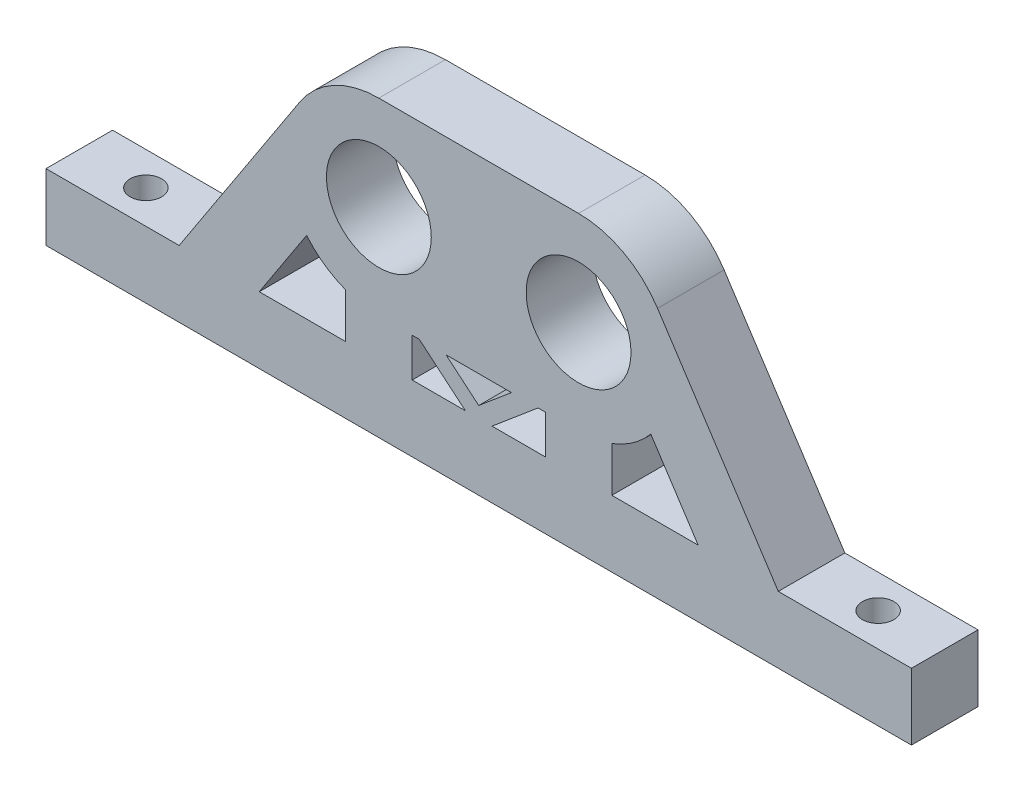
ISO-10303-21;
HEADER;
FILE_DESCRIPTION(('STEP AP214'),'2;1');
FILE_NAME('part.step','',(''),(''),'','','');
FILE_SCHEMA(('AUTOMOTIVE_DESIGN { 1 0 10303 214 1 1 1 1 }'));
ENDSEC;
DATA;
#1=APPLICATION_CONTEXT('core data for automotive mechanical design processes');
#2=APPLICATION_PROTOCOL_DEFINITION('international standard','automotive_design',2000,#1);
#3=PRODUCT_CONTEXT('',#1,'mechanical');
#4=PRODUCT('Part','Part','',(#3));
#5=PRODUCT_RELATED_PRODUCT_CATEGORY('part','',(#4));
#6=PRODUCT_DEFINITION_FORMATION('','',#4);
#7=PRODUCT_DEFINITION_CONTEXT('part definition',#1,'design');
#8=PRODUCT_DEFINITION('design','',#6,#7);
#9=PRODUCT_DEFINITION_SHAPE('','',#8);
#10=(LENGTH_UNIT() NAMED_UNIT(*) SI_UNIT(.MILLI.,.METRE.));
#11=(NAMED_UNIT(*) PLANE_ANGLE_UNIT() SI_UNIT($,.RADIAN.));
#12=(NAMED_UNIT(*) SI_UNIT($,.STERADIAN.) SOLID_ANGLE_UNIT());
#13=UNCERTAINTY_MEASURE_WITH_UNIT(LENGTH_MEASURE(1.E-05),#10,'distance_accuracy_value','');
#14=(GEOMETRIC_REPRESENTATION_CONTEXT(3) GLOBAL_UNCERTAINTY_ASSIGNED_CONTEXT((#13)) GLOBAL_UNIT_ASSIGNED_CONTEXT((#10,
#11,#12)) REPRESENTATION_CONTEXT('',''));
#15=CARTESIAN_POINT('',(0.,0.,0.));
#16=DIRECTION('',(0.,0.,1.));
#17=DIRECTION('',(1.,0.,0.));
#18=AXIS2_PLACEMENT_3D('',#15,#16,#17);
#19=CARTESIAN_POINT('',(-2.17890041270888,1.42380954605319,-6.35));
#20=DIRECTION('',(-0.837120234007988,0.547018933689147,0.));
#21=DIRECTION('',(-0.547018933689147,-0.837120234007988,0.));
#22=AXIS2_PLACEMENT_3D('',#19,#20,#21);
#23=PLANE('',#22);
#24=DIRECTION('',(-0.547018933689148,-0.837120234007988,0.));
#25=VECTOR('',#24,1.);
#26=CARTESIAN_POINT('',(-2.17890041270888,1.42380954605319,0.));
#27=LINE('',#26,#25);
#28=CARTESIAN_POINT('',(-6.89168867397579,-5.78831816860423,0.));
#29=VERTEX_POINT('',#28);
#30=CARTESIAN_POINT('',(-11.4081495977631,-12.7,0.));
#31=VERTEX_POINT('',#30);
#32=EDGE_CURVE('E395',#29,#31,#27,.T.);
#33=ORIENTED_EDGE('',*,*,#32,.T.);
#34=DIRECTION('',(0.,0.,1.));
#35=VECTOR('',#34,1.);
#36=CARTESIAN_POINT('',(-11.4081495977631,-12.7,-6.35));
#37=LINE('',#36,#35);
#38=CARTESIAN_POINT('',(-11.4081495977631,-12.7,-6.35));
#39=VERTEX_POINT('',#38);
#40=EDGE_CURVE('E11',#39,#31,#37,.T.);
#41=ORIENTED_EDGE('',*,*,#40,.F.);
#42=DIRECTION('',(-0.547018933689148,-0.837120234007988,0.));
#43=VECTOR('',#42,1.);
#44=CARTESIAN_POINT('',(-2.17890041270888,1.42380954605319,-6.35));
#45=LINE('',#44,#43);
#46=CARTESIAN_POINT('',(-6.89168867397579,-5.78831816860423,-6.35));
#47=VERTEX_POINT('',#46);
#48=EDGE_CURVE('E251',#47,#39,#45,.T.);
#49=ORIENTED_EDGE('',*,*,#48,.F.);
#50=DIRECTION('',(0.,0.,1.));
#51=VECTOR('',#50,1.);
#52=CARTESIAN_POINT('',(-6.89168867397579,-5.78831816860423,-6.35));
#53=LINE('',#52,#51);
#54=EDGE_CURVE('E242',#47,#29,#53,.T.);
#55=ORIENTED_EDGE('',*,*,#54,.T.);
#56=EDGE_LOOP('',(#33,#41,#49,#55));
#57=FACE_BOUND('',#56,.T.);
#58=ADVANCED_FACE('F35',(#57),#23,.F.);
#59=CARTESIAN_POINT('',(0.,-12.7,-6.35));
#60=DIRECTION('',(0.,-1.,0.));
#61=DIRECTION('',(0.,0.,-1.));
#62=AXIS2_PLACEMENT_3D('',#59,#60,#61);
#63=PLANE('',#62);
#64=DIRECTION('',(1.,0.,0.));
#65=VECTOR('',#64,1.);
#66=CARTESIAN_POINT('',(0.,-12.7,0.));
#67=LINE('',#66,#65);
#68=CARTESIAN_POINT('',(-3.175,-12.7,0.));
#69=VERTEX_POINT('',#68);
#70=EDGE_CURVE('E150',#31,#69,#67,.T.);
#71=ORIENTED_EDGE('',*,*,#70,.T.);
#72=DIRECTION('',(0.,0.,1.));
#73=VECTOR('',#72,1.);
#74=CARTESIAN_POINT('',(-3.175,-12.7,-6.35));
#75=LINE('',#74,#73);
#76=CARTESIAN_POINT('',(-3.175,-12.7,-6.35));
#77=VERTEX_POINT('',#76);
#78=EDGE_CURVE('E45',#77,#69,#75,.T.);
#79=ORIENTED_EDGE('',*,*,#78,.F.);
#80=DIRECTION('',(1.,0.,0.));
#81=VECTOR('',#80,1.);
#82=CARTESIAN_POINT('',(0.,-12.7,-6.35));
#83=LINE('',#82,#81);
#84=EDGE_CURVE('E53',#39,#77,#83,.T.);
#85=ORIENTED_EDGE('',*,*,#84,.F.);
#86=ORIENTED_EDGE('',*,*,#40,.T.);
#87=EDGE_LOOP('',(#71,#79,#85,#86));
#88=FACE_BOUND('',#87,.T.);
#89=ADVANCED_FACE('F561',(#88),#63,.F.);
#90=CARTESIAN_POINT('',(-3.175,0.,-6.35));
#91=DIRECTION('',(-1.,0.,0.));
#92=DIRECTION('',(0.,-1.,0.));
#93=AXIS2_PLACEMENT_3D('',#90,#91,#92);
#94=PLANE('',#93);
#95=DIRECTION('',(0.,-1.,0.));
#96=VECTOR('',#95,1.);
#97=CARTESIAN_POINT('',(-3.175,0.,0.));
#98=LINE('',#97,#96);
#99=CARTESIAN_POINT('',(-3.175,-8.42136420065063,0.));
#100=VERTEX_POINT('',#99);
#101=EDGE_CURVE('E237',#100,#69,#98,.T.);
#102=ORIENTED_EDGE('',*,*,#101,.F.);
#103=DIRECTION('',(0.,0.,1.));
#104=VECTOR('',#103,1.);
#105=CARTESIAN_POINT('',(-3.175,-8.42136420065063,-6.35));
#106=LINE('',#105,#104);
#107=CARTESIAN_POINT('',(-3.175,-8.42136420065063,-6.35));
#108=VERTEX_POINT('',#107);
#109=EDGE_CURVE('E233',#108,#100,#106,.T.);
#110=ORIENTED_EDGE('',*,*,#109,.F.);
#111=DIRECTION('',(0.,-1.,0.));
#112=VECTOR('',#111,1.);
#113=CARTESIAN_POINT('',(-3.175,0.,-6.35));
#114=LINE('',#113,#112);
#115=EDGE_CURVE('E236',#108,#77,#114,.T.);
#116=ORIENTED_EDGE('',*,*,#115,.T.);
#117=ORIENTED_EDGE('',*,*,#78,.T.);
#118=EDGE_LOOP('',(#102,#110,#116,#117));
#119=FACE_BOUND('',#118,.T.);
#120=ADVANCED_FACE('F235',(#119),#94,.T.);
#121=CARTESIAN_POINT('',(19.05,0.,-6.35));
#122=DIRECTION('',(0.,0.,1.));
#123=DIRECTION('',(1.,0.,0.));
#124=AXIS2_PLACEMENT_3D('',#121,#122,#123);
#125=CYLINDRICAL_SURFACE('',#124,9.00000000000001);
#126=CARTESIAN_POINT('',(19.05,0.,0.));
#127=DIRECTION('',(0.,0.,1.));
#128=DIRECTION('',(1.,0.,0.));
#129=AXIS2_PLACEMENT_3D('',#126,#127,#128);
#130=CIRCLE('',#129,9.00000000000001);
#131=CARTESIAN_POINT('',(22.225,-8.42136420065063,0.));
#132=VERTEX_POINT('',#131);
#133=CARTESIAN_POINT('',(25.9416886739758,-5.78831816860423,0.));
#134=VERTEX_POINT('',#133);
#135=EDGE_CURVE('E387',#132,#134,#130,.T.);
#136=ORIENTED_EDGE('',*,*,#135,.F.);
#137=DIRECTION('',(0.,0.,1.));
#138=VECTOR('',#137,1.);
#139=CARTESIAN_POINT('',(22.225,-8.42136420065063,-6.35));
#140=LINE('',#139,#138);
#141=CARTESIAN_POINT('',(22.225,-8.42136420065063,-6.35));
#142=VERTEX_POINT('',#141);
#143=EDGE_CURVE('E401',#142,#132,#140,.T.);
#144=ORIENTED_EDGE('',*,*,#143,.F.);
#145=CARTESIAN_POINT('',(19.05,0.,-6.35));
#146=DIRECTION('',(0.,0.,1.));
#147=DIRECTION('',(1.,0.,0.));
#148=AXIS2_PLACEMENT_3D('',#145,#146,#147);
#149=CIRCLE('',#148,9.00000000000001);
#150=CARTESIAN_POINT('',(25.9416886739758,-5.78831816860423,-6.35));
#151=VERTEX_POINT('',#150);
#152=EDGE_CURVE('E273',#142,#151,#149,.T.);
#153=ORIENTED_EDGE('',*,*,#152,.T.);
#154=DIRECTION('',(0.,0.,1.));
#155=VECTOR('',#154,1.);
#156=CARTESIAN_POINT('',(25.9416886739758,-5.78831816860423,-6.35));
#157=LINE('',#156,#155);
#158=EDGE_CURVE('E408',#151,#134,#157,.T.);
#159=ORIENTED_EDGE('',*,*,#158,.T.);
#160=EDGE_LOOP('',(#136,#144,#153,#159));
#161=FACE_BOUND('',#160,.T.);
#162=ADVANCED_FACE('F575',(#161),#125,.T.);
#163=CARTESIAN_POINT('',(22.225,0.,-6.35));
#164=DIRECTION('',(-1.,0.,0.));
#165=DIRECTION('',(0.,-1.,0.));
#166=AXIS2_PLACEMENT_3D('',#163,#164,#165);
#167=PLANE('',#166);
#168=DIRECTION('',(0.,-1.,0.));
#169=VECTOR('',#168,1.);
#170=CARTESIAN_POINT('',(22.225,0.,0.));
#171=LINE('',#170,#169);
#172=CARTESIAN_POINT('',(22.225,-12.7,0.));
#173=VERTEX_POINT('',#172);
#174=EDGE_CURVE('E392',#132,#173,#171,.T.);
#175=ORIENTED_EDGE('',*,*,#174,.T.);
#176=DIRECTION('',(0.,0.,1.));
#177=VECTOR('',#176,1.);
#178=CARTESIAN_POINT('',(22.225,-12.7,-6.35));
#179=LINE('',#178,#177);
#180=CARTESIAN_POINT('',(22.225,-12.7,-6.35));
#181=VERTEX_POINT('',#180);
#182=EDGE_CURVE('E403',#181,#173,#179,.T.);
#183=ORIENTED_EDGE('',*,*,#182,.F.);
#184=DIRECTION('',(0.,-1.,0.));
#185=VECTOR('',#184,1.);
#186=CARTESIAN_POINT('',(22.225,0.,-6.35));
#187=LINE('',#186,#185);
#188=EDGE_CURVE('E254',#142,#181,#187,.T.);
#189=ORIENTED_EDGE('',*,*,#188,.F.);
#190=ORIENTED_EDGE('',*,*,#143,.T.);
#191=EDGE_LOOP('',(#175,#183,#189,#190));
#192=FACE_BOUND('',#191,.T.);
#193=ADVANCED_FACE('F572',(#192),#167,.F.);
#194=CARTESIAN_POINT('',(30.4581495977631,-12.7,0.));
#195=VERTEX_POINT('',#194);
#196=EDGE_CURVE('E391',#173,#195,#67,.T.);
#197=ORIENTED_EDGE('',*,*,#196,.T.);
#198=DIRECTION('',(0.,0.,1.));
#199=VECTOR('',#198,1.);
#200=CARTESIAN_POINT('',(30.4581495977631,-12.7,-6.35));
#201=LINE('',#200,#199);
#202=CARTESIAN_POINT('',(30.4581495977631,-12.7,-6.35));
#203=VERTEX_POINT('',#202);
#204=EDGE_CURVE('E406',#203,#195,#201,.T.);
#205=ORIENTED_EDGE('',*,*,#204,.F.);
#206=EDGE_CURVE('E453',#181,#203,#83,.T.);
#207=ORIENTED_EDGE('',*,*,#206,.F.);
#208=ORIENTED_EDGE('',*,*,#182,.T.);
#209=EDGE_LOOP('',(#197,#205,#207,#208));
#210=FACE_BOUND('',#209,.T.);
#211=ADVANCED_FACE('F568',(#210),#63,.F.);
#212=CARTESIAN_POINT('',(26.5840821060719,4.92317040320233,0.));
#213=VERTEX_POINT('',#212);
#214=CARTESIAN_POINT('',(19.05,9.00000000000001,0.));
#215=VERTEX_POINT('',#214);
#216=EDGE_CURVE('E500',#213,#215,#130,.T.);
#217=ORIENTED_EDGE('',*,*,#216,.F.);
#218=DIRECTION('',(0.,0.,1.));
#219=VECTOR('',#218,1.);
#220=CARTESIAN_POINT('',(26.5840821060719,4.92317040320233,-6.35));
#221=LINE('',#220,#219);
#222=CARTESIAN_POINT('',(26.5840821060719,4.92317040320233,-6.35));
#223=VERTEX_POINT('',#222);
#224=EDGE_CURVE('E410',#223,#213,#221,.T.);
#225=ORIENTED_EDGE('',*,*,#224,.F.);
#226=CARTESIAN_POINT('',(19.05,9.00000000000001,-6.35));
#227=VERTEX_POINT('',#226);
#228=EDGE_CURVE('E265',#223,#227,#149,.T.);
#229=ORIENTED_EDGE('',*,*,#228,.T.);
#230=DIRECTION('',(0.,0.,1.));
#231=VECTOR('',#230,1.);
#232=CARTESIAN_POINT('',(19.05,9.00000000000001,-6.35));
#233=LINE('',#232,#231);
#234=EDGE_CURVE('E427',#227,#215,#233,.T.);
#235=ORIENTED_EDGE('',*,*,#234,.T.);
#236=EDGE_LOOP('',(#217,#225,#229,#235));
#237=FACE_BOUND('',#236,.T.);
#238=ADVANCED_FACE('F512',(#237),#125,.T.);
#239=CARTESIAN_POINT('',(20.8837560579074,13.6465581718477,-6.35));
#240=DIRECTION('',(-0.837120234007988,-0.547018933689147,0.));
#241=DIRECTION('',(0.547018933689147,-0.837120234007988,0.));
#242=AXIS2_PLACEMENT_3D('',#239,#240,#241);
#243=PLANE('',#242);
#244=DIRECTION('',(0.547018933689147,-0.837120234007988,0.));
#245=VECTOR('',#244,1.);
#246=CARTESIAN_POINT('',(20.8837560579074,13.6465581718477,0.));
#247=LINE('',#246,#245);
#248=CARTESIAN_POINT('',(38.1,-12.7,0.));
#249=VERTEX_POINT('',#248);
#250=EDGE_CURVE('E384',#213,#249,#247,.T.);
#251=ORIENTED_EDGE('',*,*,#250,.T.);
#252=DIRECTION('',(0.,0.,1.));
#253=VECTOR('',#252,1.);
#254=CARTESIAN_POINT('',(38.1,-12.7,-6.35));
#255=LINE('',#254,#253);
#256=CARTESIAN_POINT('',(38.1,-12.7,-6.35));
#257=VERTEX_POINT('',#256);
#258=EDGE_CURVE('E412',#257,#249,#255,.T.);
#259=ORIENTED_EDGE('',*,*,#258,.F.);
#260=DIRECTION('',(0.547018933689147,-0.837120234007988,0.));
#261=VECTOR('',#260,1.);
#262=CARTESIAN_POINT('',(20.8837560579074,13.6465581718477,-6.35));
#263=LINE('',#262,#261);
#264=EDGE_CURVE('E463',#223,#257,#263,.T.);
#265=ORIENTED_EDGE('',*,*,#264,.F.);
#266=ORIENTED_EDGE('',*,*,#224,.T.);
#267=EDGE_LOOP('',(#251,#259,#265,#266));
#268=FACE_BOUND('',#267,.T.);
#269=ADVANCED_FACE('F516',(#268),#243,.F.);
#270=CARTESIAN_POINT('',(44.45,-12.7,-3.175));
#271=DIRECTION('',(0.,1.,0.));
#272=DIRECTION('',(0.,0.,1.));
#273=AXIS2_PLACEMENT_3D('',#270,#271,#272);
#274=CIRCLE('',#273,1.5);
#275=CARTESIAN_POINT('',(44.45,-12.7,-1.675));
#276=VERTEX_POINT('',#275);
#277=EDGE_CURVE('E316',#276,#276,#274,.T.);
#278=ORIENTED_EDGE('',*,*,#277,.F.);
#279=EDGE_LOOP('',(#278));
#280=FACE_BOUND('',#279,.T.);
#281=CARTESIAN_POINT('',(50.8,-12.7,0.));
#282=VERTEX_POINT('',#281);
#283=EDGE_CURVE('E361',#249,#282,#67,.T.);
#284=ORIENTED_EDGE('',*,*,#283,.T.);
#285=DIRECTION('',(0.,0.,1.));
#286=VECTOR('',#285,1.);
#287=CARTESIAN_POINT('',(50.8,-12.7,-6.35));
#288=LINE('',#287,#286);
#289=CARTESIAN_POINT('',(50.8,-12.7,-6.35));
#290=VERTEX_POINT('',#289);
#291=EDGE_CURVE('E415',#290,#282,#288,.T.);
#292=ORIENTED_EDGE('',*,*,#291,.F.);
#293=EDGE_CURVE('E455',#257,#290,#83,.T.);
#294=ORIENTED_EDGE('',*,*,#293,.F.);
#295=ORIENTED_EDGE('',*,*,#258,.T.);
#296=EDGE_LOOP('',(#284,#292,#294,#295));
#297=FACE_BOUND('',#296,.T.);
#298=ADVANCED_FACE('F344',(#280,#297),#63,.F.);
#299=CARTESIAN_POINT('',(50.8,0.,-6.35));
#300=DIRECTION('',(1.,0.,0.));
#301=DIRECTION('',(0.,1.,0.));
#302=AXIS2_PLACEMENT_3D('',#299,#300,#301);
#303=PLANE('',#302);
#304=DIRECTION('',(0.,1.,0.));
#305=VECTOR('',#304,1.);
#306=CARTESIAN_POINT('',(50.8,0.,0.));
#307=LINE('',#306,#305);
#308=CARTESIAN_POINT('',(50.8,-19.05,0.));
#309=VERTEX_POINT('',#308);
#310=EDGE_CURVE('E381',#309,#282,#307,.T.);
#311=ORIENTED_EDGE('',*,*,#310,.F.);
#312=DIRECTION('',(0.,0.,1.));
#313=VECTOR('',#312,1.);
#314=CARTESIAN_POINT('',(50.8,-19.05,-6.35));
#315=LINE('',#314,#313);
#316=CARTESIAN_POINT('',(50.8,-19.05,-6.35));
#317=VERTEX_POINT('',#316);
#318=EDGE_CURVE('E417',#317,#309,#315,.T.);
#319=ORIENTED_EDGE('',*,*,#318,.F.);
#320=DIRECTION('',(0.,1.,0.));
#321=VECTOR('',#320,1.);
#322=CARTESIAN_POINT('',(50.8,0.,-6.35));
#323=LINE('',#322,#321);
#324=EDGE_CURVE('E464',#317,#290,#323,.T.);
#325=ORIENTED_EDGE('',*,*,#324,.T.);
#326=ORIENTED_EDGE('',*,*,#291,.T.);
#327=EDGE_LOOP('',(#311,#319,#325,#326));
#328=FACE_BOUND('',#327,.T.);
#329=ADVANCED_FACE('F521',(#328),#303,.T.);
#330=CARTESIAN_POINT('',(0.,-19.05,-6.35));
#331=DIRECTION('',(0.,-1.,0.));
#332=DIRECTION('',(0.,0.,-1.));
#333=AXIS2_PLACEMENT_3D('',#330,#331,#332);
#334=PLANE('',#333);
#335=CARTESIAN_POINT('',(-25.4,-19.05,-3.175));
#336=DIRECTION('',(0.,1.,0.));
#337=DIRECTION('',(0.,0.,1.));
#338=AXIS2_PLACEMENT_3D('',#335,#336,#337);
#339=CIRCLE('',#338,1.49999999999999);
#340=CARTESIAN_POINT('',(-25.4,-19.05,-1.67500000000001));
#341=VERTEX_POINT('',#340);
#342=EDGE_CURVE('E319',#341,#341,#339,.T.);
#343=ORIENTED_EDGE('',*,*,#342,.T.);
#344=EDGE_LOOP('',(#343));
#345=FACE_BOUND('',#344,.T.);
#346=CARTESIAN_POINT('',(44.45,-19.05,-3.175));
#347=DIRECTION('',(0.,1.,0.));
#348=DIRECTION('',(0.,0.,1.));
#349=AXIS2_PLACEMENT_3D('',#346,#347,#348);
#350=CIRCLE('',#349,1.5);
#351=CARTESIAN_POINT('',(44.45,-19.05,-1.675));
#352=VERTEX_POINT('',#351);
#353=EDGE_CURVE('E313',#352,#352,#350,.T.);
#354=ORIENTED_EDGE('',*,*,#353,.T.);
#355=EDGE_LOOP('',(#354));
#356=FACE_BOUND('',#355,.T.);
#357=DIRECTION('',(1.,0.,0.));
#358=VECTOR('',#357,1.);
#359=CARTESIAN_POINT('',(0.,-19.05,0.));
#360=LINE('',#359,#358);
#361=CARTESIAN_POINT('',(-31.75,-19.05,0.));
#362=VERTEX_POINT('',#361);
#363=EDGE_CURVE('E378',#362,#309,#360,.T.);
#364=ORIENTED_EDGE('',*,*,#363,.F.);
#365=DIRECTION('',(0.,0.,1.));
#366=VECTOR('',#365,1.);
#367=CARTESIAN_POINT('',(-31.75,-19.05,-6.35));
#368=LINE('',#367,#366);
#369=CARTESIAN_POINT('',(-31.75,-19.05,-6.35));
#370=VERTEX_POINT('',#369);
#371=EDGE_CURVE('E419',#370,#362,#368,.T.);
#372=ORIENTED_EDGE('',*,*,#371,.F.);
#373=DIRECTION('',(1.,0.,0.));
#374=VECTOR('',#373,1.);
#375=CARTESIAN_POINT('',(0.,-19.05,-6.35));
#376=LINE('',#375,#374);
#377=EDGE_CURVE('E470',#370,#317,#376,.T.);
#378=ORIENTED_EDGE('',*,*,#377,.T.);
#379=ORIENTED_EDGE('',*,*,#318,.T.);
#380=EDGE_LOOP('',(#364,#372,#378,#379));
#381=FACE_BOUND('',#380,.T.);
#382=ADVANCED_FACE('F328',(#345,#356,#381),#334,.T.);
#383=CARTESIAN_POINT('',(-31.75,0.,-6.35));
#384=DIRECTION('',(1.,0.,0.));
#385=DIRECTION('',(0.,0.,-1.));
#386=AXIS2_PLACEMENT_3D('',#383,#384,#385);
#387=PLANE('',#386);
#388=DIRECTION('',(0.,1.,0.));
#389=VECTOR('',#388,1.);
#390=CARTESIAN_POINT('',(-31.75,0.,0.));
#391=LINE('',#390,#389);
#392=CARTESIAN_POINT('',(-31.75,-12.7,0.));
#393=VERTEX_POINT('',#392);
#394=EDGE_CURVE('E357',#362,#393,#391,.T.);
#395=ORIENTED_EDGE('',*,*,#394,.T.);
#396=DIRECTION('',(0.,0.,1.));
#397=VECTOR('',#396,1.);
#398=CARTESIAN_POINT('',(-31.75,-12.7,-6.35));
#399=LINE('',#398,#397);
#400=CARTESIAN_POINT('',(-31.75,-12.7,-6.35));
#401=VERTEX_POINT('',#400);
#402=EDGE_CURVE('E353',#401,#393,#399,.T.);
#403=ORIENTED_EDGE('',*,*,#402,.F.);
#404=DIRECTION('',(0.,1.,0.));
#405=VECTOR('',#404,1.);
#406=CARTESIAN_POINT('',(-31.75,0.,-6.35));
#407=LINE('',#406,#405);
#408=EDGE_CURVE('E472',#370,#401,#407,.T.);
#409=ORIENTED_EDGE('',*,*,#408,.F.);
#410=ORIENTED_EDGE('',*,*,#371,.T.);
#411=EDGE_LOOP('',(#395,#403,#409,#410));
#412=FACE_BOUND('',#411,.T.);
#413=ADVANCED_FACE('F342',(#412),#387,.F.);
#414=CARTESIAN_POINT('',(-25.4,-12.7,-3.175));
#415=DIRECTION('',(0.,1.,0.));
#416=DIRECTION('',(0.,0.,1.));
#417=AXIS2_PLACEMENT_3D('',#414,#415,#416);
#418=CIRCLE('',#417,1.49999999999999);
#419=CARTESIAN_POINT('',(-25.4,-12.7,-1.67500000000001));
#420=VERTEX_POINT('',#419);
#421=EDGE_CURVE('E322',#420,#420,#418,.T.);
#422=ORIENTED_EDGE('',*,*,#421,.F.);
#423=EDGE_LOOP('',(#422));
#424=FACE_BOUND('',#423,.T.);
#425=CARTESIAN_POINT('',(-19.05,-12.7,0.));
#426=VERTEX_POINT('',#425);
#427=EDGE_CURVE('E349',#393,#426,#67,.T.);
#428=ORIENTED_EDGE('',*,*,#427,.T.);
#429=DIRECTION('',(0.,0.,1.));
#430=VECTOR('',#429,1.);
#431=CARTESIAN_POINT('',(-19.05,-12.7,-6.35));
#432=LINE('',#431,#430);
#433=CARTESIAN_POINT('',(-19.05,-12.7,-6.35));
#434=VERTEX_POINT('',#433);
#435=EDGE_CURVE('E351',#434,#426,#432,.T.);
#436=ORIENTED_EDGE('',*,*,#435,.F.);
#437=EDGE_CURVE('E264',#401,#434,#83,.T.);
#438=ORIENTED_EDGE('',*,*,#437,.F.);
#439=ORIENTED_EDGE('',*,*,#402,.T.);
#440=EDGE_LOOP('',(#428,#436,#438,#439));
#441=FACE_BOUND('',#440,.T.);
#442=ADVANCED_FACE('F338',(#424,#441),#63,.F.);
#443=CARTESIAN_POINT('',(-7.53408210607189,4.92317040320233,-6.35));
#444=DIRECTION('',(-0.837120234007988,0.547018933689147,0.));
#445=DIRECTION('',(-0.547018933689147,-0.837120234007988,0.));
#446=AXIS2_PLACEMENT_3D('',#443,#444,#445);
#447=PLANE('',#446);
#448=DIRECTION('',(-0.547018933689147,-0.837120234007988,0.));
#449=VECTOR('',#448,1.);
#450=CARTESIAN_POINT('',(-7.53408210607189,4.92317040320233,0.));
#451=LINE('',#450,#449);
#452=CARTESIAN_POINT('',(-7.53408210607189,4.92317040320233,0.));
#453=VERTEX_POINT('',#452);
#454=EDGE_CURVE('E358',#453,#426,#451,.T.);
#455=ORIENTED_EDGE('',*,*,#454,.F.);
#456=DIRECTION('',(0.,0.,1.));
#457=VECTOR('',#456,1.);
#458=CARTESIAN_POINT('',(-7.53408210607189,4.92317040320233,-6.35));
#459=LINE('',#458,#457);
#460=CARTESIAN_POINT('',(-7.53408210607189,4.92317040320233,-6.35));
#461=VERTEX_POINT('',#460);
#462=EDGE_CURVE('E423',#461,#453,#459,.T.);
#463=ORIENTED_EDGE('',*,*,#462,.F.);
#464=DIRECTION('',(-0.547018933689147,-0.837120234007988,0.));
#465=VECTOR('',#464,1.);
#466=CARTESIAN_POINT('',(-7.53408210607189,4.92317040320233,-6.35));
#467=LINE('',#466,#465);
#468=EDGE_CURVE('E259',#461,#434,#467,.T.);
#469=ORIENTED_EDGE('',*,*,#468,.T.);
#470=ORIENTED_EDGE('',*,*,#435,.T.);
#471=EDGE_LOOP('',(#455,#463,#469,#470));
#472=FACE_BOUND('',#471,.T.);
#473=ADVANCED_FACE('F341',(#472),#447,.T.);
#474=CARTESIAN_POINT('',(0.,0.,-6.35));
#475=DIRECTION('',(0.,0.,1.));
#476=DIRECTION('',(1.,0.,0.));
#477=AXIS2_PLACEMENT_3D('',#474,#475,#476);
#478=CYLINDRICAL_SURFACE('',#477,9.);
#479=CARTESIAN_POINT('',(0.,0.,0.));
#480=DIRECTION('',(0.,0.,1.));
#481=DIRECTION('',(1.,0.,0.));
#482=AXIS2_PLACEMENT_3D('',#479,#480,#481);
#483=CIRCLE('',#482,9.);
#484=CARTESIAN_POINT('',(0.,9.,0.));
#485=VERTEX_POINT('',#484);
#486=EDGE_CURVE('E369',#485,#453,#483,.T.);
#487=ORIENTED_EDGE('',*,*,#486,.F.);
#488=DIRECTION('',(0.,0.,1.));
#489=VECTOR('',#488,1.);
#490=CARTESIAN_POINT('',(0.,9.,-6.35));
#491=LINE('',#490,#489);
#492=CARTESIAN_POINT('',(0.,9.,-6.35));
#493=VERTEX_POINT('',#492);
#494=EDGE_CURVE('E425',#493,#485,#491,.T.);
#495=ORIENTED_EDGE('',*,*,#494,.F.);
#496=CARTESIAN_POINT('',(0.,0.,-6.35));
#497=DIRECTION('',(0.,0.,1.));
#498=DIRECTION('',(1.,0.,0.));
#499=AXIS2_PLACEMENT_3D('',#496,#497,#498);
#500=CIRCLE('',#499,9.);
#501=EDGE_CURVE('E253',#493,#461,#500,.T.);
#502=ORIENTED_EDGE('',*,*,#501,.T.);
#503=ORIENTED_EDGE('',*,*,#462,.T.);
#504=EDGE_LOOP('',(#487,#495,#502,#503));
#505=FACE_BOUND('',#504,.T.);
#506=ADVANCED_FACE('F596',(#505),#478,.T.);
#507=CARTESIAN_POINT('',(0.,-9.,-6.35));
#508=DIRECTION('',(0.,-1.,0.));
#509=DIRECTION('',(1.,0.,0.));
#510=AXIS2_PLACEMENT_3D('',#507,#508,#509);
#511=PLANE('',#510);
#512=DIRECTION('',(1.,0.,0.));
#513=VECTOR('',#512,1.);
#514=CARTESIAN_POINT('',(0.,-9.,0.));
#515=LINE('',#514,#513);
#516=CARTESIAN_POINT('',(3.175,-9.,0.));
#517=VERTEX_POINT('',#516);
#518=CARTESIAN_POINT('',(3.8620110003618,-9.,0.));
#519=VERTEX_POINT('',#518);
#520=EDGE_CURVE('E493',#517,#519,#515,.T.);
#521=ORIENTED_EDGE('',*,*,#520,.F.);
#522=DIRECTION('',(0.,0.,1.));
#523=VECTOR('',#522,1.);
#524=CARTESIAN_POINT('',(3.175,-9.,-6.35));
#525=LINE('',#524,#523);
#526=CARTESIAN_POINT('',(3.175,-9.,-6.35));
#527=VERTEX_POINT('',#526);
#528=EDGE_CURVE('E429',#527,#517,#525,.T.);
#529=ORIENTED_EDGE('',*,*,#528,.F.);
#530=DIRECTION('',(1.,0.,0.));
#531=VECTOR('',#530,1.);
#532=CARTESIAN_POINT('',(0.,-9.,-6.35));
#533=LINE('',#532,#531);
#534=CARTESIAN_POINT('',(3.8620110003618,-9.,-6.35));
#535=VERTEX_POINT('',#534);
#536=EDGE_CURVE('E281',#527,#535,#533,.T.);
#537=ORIENTED_EDGE('',*,*,#536,.T.);
#538=DIRECTION('',(0.,0.,1.));
#539=VECTOR('',#538,1.);
#540=CARTESIAN_POINT('',(3.8620110003618,-9.,-6.35));
#541=LINE('',#540,#539);
#542=EDGE_CURVE('E436',#535,#519,#541,.T.);
#543=ORIENTED_EDGE('',*,*,#542,.T.);
#544=EDGE_LOOP('',(#521,#529,#537,#543));
#545=FACE_BOUND('',#544,.T.);
#546=ADVANCED_FACE('F492',(#545),#511,.T.);
#547=CARTESIAN_POINT('',(3.175,0.,-6.35));
#548=DIRECTION('',(-1.,0.,0.));
#549=DIRECTION('',(0.,-1.,0.));
#550=AXIS2_PLACEMENT_3D('',#547,#548,#549);
#551=PLANE('',#550);
#552=DIRECTION('',(0.,-1.,0.));
#553=VECTOR('',#552,1.);
#554=CARTESIAN_POINT('',(3.175,0.,0.));
#555=LINE('',#554,#553);
#556=CARTESIAN_POINT('',(3.175,-12.7,0.));
#557=VERTEX_POINT('',#556);
#558=EDGE_CURVE('E498',#517,#557,#555,.T.);
#559=ORIENTED_EDGE('',*,*,#558,.T.);
#560=DIRECTION('',(0.,0.,1.));
#561=VECTOR('',#560,1.);
#562=CARTESIAN_POINT('',(3.175,-12.7,-6.35));
#563=LINE('',#562,#561);
#564=CARTESIAN_POINT('',(3.175,-12.7,-6.35));
#565=VERTEX_POINT('',#564);
#566=EDGE_CURVE('E431',#565,#557,#563,.T.);
#567=ORIENTED_EDGE('',*,*,#566,.F.);
#568=DIRECTION('',(0.,-1.,0.));
#569=VECTOR('',#568,1.);
#570=CARTESIAN_POINT('',(3.175,0.,-6.35));
#571=LINE('',#570,#569);
#572=EDGE_CURVE('E271',#527,#565,#571,.T.);
#573=ORIENTED_EDGE('',*,*,#572,.F.);
#574=ORIENTED_EDGE('',*,*,#528,.T.);
#575=EDGE_LOOP('',(#559,#567,#573,#574));
#576=FACE_BOUND('',#575,.T.);
#577=ADVANCED_FACE('F497',(#576),#551,.F.);
#578=CARTESIAN_POINT('',(8.255,-12.7,0.));
#579=VERTEX_POINT('',#578);
#580=EDGE_CURVE('E360',#557,#579,#67,.T.);
#581=ORIENTED_EDGE('',*,*,#580,.T.);
#582=DIRECTION('',(0.,0.,1.));
#583=VECTOR('',#582,1.);
#584=CARTESIAN_POINT('',(8.255,-12.7,-6.35));
#585=LINE('',#584,#583);
#586=CARTESIAN_POINT('',(8.255,-12.7,-6.35));
#587=VERTEX_POINT('',#586);
#588=EDGE_CURVE('E434',#587,#579,#585,.T.);
#589=ORIENTED_EDGE('',*,*,#588,.F.);
#590=EDGE_CURVE('E277',#565,#587,#83,.T.);
#591=ORIENTED_EDGE('',*,*,#590,.F.);
#592=ORIENTED_EDGE('',*,*,#566,.T.);
#593=EDGE_LOOP('',(#581,#589,#591,#592));
#594=FACE_BOUND('',#593,.T.);
#595=ADVANCED_FACE('F345',(#594),#63,.F.);
#596=CARTESIAN_POINT('',(0.,-9.,-6.35));
#597=DIRECTION('',(0.,-1.,0.));
#598=DIRECTION('',(1.,0.,0.));
#599=AXIS2_PLACEMENT_3D('',#596,#597,#598);
#600=PLANE('',#599);
#601=DIRECTION('',(1.,0.,0.));
#602=VECTOR('',#601,1.);
#603=CARTESIAN_POINT('',(0.,-9.,0.));
#604=LINE('',#603,#602);
#605=CARTESIAN_POINT('',(6.40201100036181,-9.,0.));
#606=VERTEX_POINT('',#605);
#607=CARTESIAN_POINT('',(12.6479889996382,-9.00000000000001,0.));
#608=VERTEX_POINT('',#607);
#609=EDGE_CURVE('E537',#606,#608,#604,.T.);
#610=ORIENTED_EDGE('',*,*,#609,.F.);
#611=DIRECTION('',(0.,0.,1.));
#612=VECTOR('',#611,1.);
#613=CARTESIAN_POINT('',(6.40201100036181,-9.,-6.35));
#614=LINE('',#613,#612);
#615=CARTESIAN_POINT('',(6.40201100036181,-9.,-6.35));
#616=VERTEX_POINT('',#615);
#617=EDGE_CURVE('E438',#616,#606,#614,.T.);
#618=ORIENTED_EDGE('',*,*,#617,.F.);
#619=DIRECTION('',(1.,0.,0.));
#620=VECTOR('',#619,1.);
#621=CARTESIAN_POINT('',(0.,-9.,-6.35));
#622=LINE('',#621,#620);
#623=CARTESIAN_POINT('',(12.6479889996382,-9.00000000000001,-6.35));
#624=VERTEX_POINT('',#623);
#625=EDGE_CURVE('E289',#616,#624,#622,.T.);
#626=ORIENTED_EDGE('',*,*,#625,.T.);
#627=DIRECTION('',(0.,0.,1.));
#628=VECTOR('',#627,1.);
#629=CARTESIAN_POINT('',(12.6479889996382,-9.00000000000001,-6.35));
#630=LINE('',#629,#628);
#631=EDGE_CURVE('E442',#624,#608,#630,.T.);
#632=ORIENTED_EDGE('',*,*,#631,.T.);
#633=EDGE_LOOP('',(#610,#618,#626,#632));
#634=FACE_BOUND('',#633,.T.);
#635=ADVANCED_FACE('F609',(#634),#600,.T.);
#636=CARTESIAN_POINT('',(-1.77768815093076,-2.11063905184487,-6.35));
#637=DIRECTION('',(-0.644201025364622,-0.764856221076334,0.));
#638=DIRECTION('',(0.764856221076334,-0.644201025364622,0.));
#639=AXIS2_PLACEMENT_3D('',#636,#637,#638);
#640=PLANE('',#639);
#641=DIRECTION('',(0.764856221076334,-0.644201025364622,0.));
#642=VECTOR('',#641,1.);
#643=CARTESIAN_POINT('',(-1.77768815093076,-2.11063905184487,0.));
#644=LINE('',#643,#642);
#645=CARTESIAN_POINT('',(9.525,-11.6303410501627,0.));
#646=VERTEX_POINT('',#645);
#647=EDGE_CURVE('E543',#606,#646,#644,.T.);
#648=ORIENTED_EDGE('',*,*,#647,.T.);
#649=DIRECTION('',(0.,0.,1.));
#650=VECTOR('',#649,1.);
#651=CARTESIAN_POINT('',(9.525,-11.6303410501627,-6.35));
#652=LINE('',#651,#650);
#653=CARTESIAN_POINT('',(9.525,-11.6303410501627,-6.35));
#654=VERTEX_POINT('',#653);
#655=EDGE_CURVE('E440',#654,#646,#652,.T.);
#656=ORIENTED_EDGE('',*,*,#655,.F.);
#657=DIRECTION('',(0.764856221076334,-0.644201025364622,0.));
#658=VECTOR('',#657,1.);
#659=CARTESIAN_POINT('',(-1.77768815093076,-2.11063905184487,-6.35));
#660=LINE('',#659,#658);
#661=EDGE_CURVE('E284',#616,#654,#660,.T.);
#662=ORIENTED_EDGE('',*,*,#661,.F.);
#663=ORIENTED_EDGE('',*,*,#617,.T.);
#664=EDGE_LOOP('',(#648,#656,#662,#663));
#665=FACE_BOUND('',#664,.T.);
#666=ADVANCED_FACE('F606',(#665),#640,.F.);
#667=CARTESIAN_POINT('',(10.7374293606659,-12.748488936702,-6.35));
#668=DIRECTION('',(-0.644201025364622,0.764856221076334,0.));
#669=DIRECTION('',(-0.764856221076334,-0.644201025364622,0.));
#670=AXIS2_PLACEMENT_3D('',#667,#668,#669);
#671=PLANE('',#670);
#672=DIRECTION('',(-0.764856221076334,-0.644201025364622,0.));
#673=VECTOR('',#672,1.);
#674=CARTESIAN_POINT('',(10.7374293606659,-12.748488936702,0.));
#675=LINE('',#674,#673);
#676=CARTESIAN_POINT('',(15.1879889996382,-9.00000000000001,0.));
#677=VERTEX_POINT('',#676);
#678=CARTESIAN_POINT('',(10.795,-12.7,0.));
#679=VERTEX_POINT('',#678);
#680=EDGE_CURVE('E309',#677,#679,#675,.T.);
#681=ORIENTED_EDGE('',*,*,#680,.T.);
#682=DIRECTION('',(0.,0.,1.));
#683=VECTOR('',#682,1.);
#684=CARTESIAN_POINT('',(10.795,-12.7,-6.35));
#685=LINE('',#684,#683);
#686=CARTESIAN_POINT('',(10.795,-12.7,-6.35));
#687=VERTEX_POINT('',#686);
#688=EDGE_CURVE('E444',#687,#679,#685,.T.);
#689=ORIENTED_EDGE('',*,*,#688,.F.);
#690=DIRECTION('',(-0.764856221076334,-0.644201025364622,0.));
#691=VECTOR('',#690,1.);
#692=CARTESIAN_POINT('',(10.7374293606659,-12.748488936702,-6.35));
#693=LINE('',#692,#691);
#694=CARTESIAN_POINT('',(15.1879889996382,-9.00000000000001,-6.35));
#695=VERTEX_POINT('',#694);
#696=EDGE_CURVE('E299',#695,#687,#693,.T.);
#697=ORIENTED_EDGE('',*,*,#696,.F.);
#698=DIRECTION('',(0.,0.,1.));
#699=VECTOR('',#698,1.);
#700=CARTESIAN_POINT('',(15.1879889996382,-9.00000000000001,-6.35));
#701=LINE('',#700,#699);
#702=EDGE_CURVE('E39',#695,#677,#701,.T.);
#703=ORIENTED_EDGE('',*,*,#702,.T.);
#704=EDGE_LOOP('',(#681,#689,#697,#703));
#705=FACE_BOUND('',#704,.T.);
#706=ADVANCED_FACE('F37',(#705),#671,.F.);
#707=CARTESIAN_POINT('',(15.875,-12.7,0.));
#708=VERTEX_POINT('',#707);
#709=EDGE_CURVE('E503',#679,#708,#67,.T.);
#710=ORIENTED_EDGE('',*,*,#709,.T.);
#711=DIRECTION('',(0.,0.,1.));
#712=VECTOR('',#711,1.);
#713=CARTESIAN_POINT('',(15.875,-12.7,-6.35));
#714=LINE('',#713,#712);
#715=CARTESIAN_POINT('',(15.875,-12.7,-6.35));
#716=VERTEX_POINT('',#715);
#717=EDGE_CURVE('E447',#716,#708,#714,.T.);
#718=ORIENTED_EDGE('',*,*,#717,.F.);
#719=EDGE_CURVE('E292',#687,#716,#83,.T.);
#720=ORIENTED_EDGE('',*,*,#719,.F.);
#721=ORIENTED_EDGE('',*,*,#688,.T.);
#722=EDGE_LOOP('',(#710,#718,#720,#721));
#723=FACE_BOUND('',#722,.T.);
#724=ADVANCED_FACE('F567',(#723),#63,.F.);
#725=CARTESIAN_POINT('',(15.875,0.,-6.35));
#726=DIRECTION('',(-1.,0.,0.));
#727=DIRECTION('',(0.,0.,1.));
#728=AXIS2_PLACEMENT_3D('',#725,#726,#727);
#729=PLANE('',#728);
#730=DIRECTION('',(0.,-1.,0.));
#731=VECTOR('',#730,1.);
#732=CARTESIAN_POINT('',(15.875,0.,0.));
#733=LINE('',#732,#731);
#734=CARTESIAN_POINT('',(15.875,-9.00000000000001,0.));
#735=VERTEX_POINT('',#734);
#736=EDGE_CURVE('E533',#735,#708,#733,.T.);
#737=ORIENTED_EDGE('',*,*,#736,.F.);
#738=DIRECTION('',(0.,0.,1.));
#739=VECTOR('',#738,1.);
#740=CARTESIAN_POINT('',(15.875,-9.00000000000001,-6.35));
#741=LINE('',#740,#739);
#742=CARTESIAN_POINT('',(15.875,-9.00000000000001,-6.35));
#743=VERTEX_POINT('',#742);
#744=EDGE_CURVE('E448',#743,#735,#741,.T.);
#745=ORIENTED_EDGE('',*,*,#744,.F.);
#746=DIRECTION('',(0.,-1.,0.));
#747=VECTOR('',#746,1.);
#748=CARTESIAN_POINT('',(15.875,0.,-6.35));
#749=LINE('',#748,#747);
#750=EDGE_CURVE('E294',#743,#716,#749,.T.);
#751=ORIENTED_EDGE('',*,*,#750,.T.);
#752=ORIENTED_EDGE('',*,*,#717,.T.);
#753=EDGE_LOOP('',(#737,#745,#751,#752));
#754=FACE_BOUND('',#753,.T.);
#755=ADVANCED_FACE('F580',(#754),#729,.T.);
#756=CARTESIAN_POINT('',(15.5285743645443,10.1471973146985,-6.35));
#757=DIRECTION('',(-0.837120234007988,-0.547018933689147,0.));
#758=DIRECTION('',(0.547018933689147,-0.837120234007988,0.));
#759=AXIS2_PLACEMENT_3D('',#756,#757,#758);
#760=PLANE('',#759);
#761=DIRECTION('',(0.547018933689147,-0.837120234007988,0.));
#762=VECTOR('',#761,1.);
#763=CARTESIAN_POINT('',(15.5285743645443,10.1471973146985,0.));
#764=LINE('',#763,#762);
#765=EDGE_CURVE('E388',#134,#195,#764,.T.);
#766=ORIENTED_EDGE('',*,*,#765,.F.);
#767=ORIENTED_EDGE('',*,*,#158,.F.);
#768=DIRECTION('',(0.547018933689147,-0.837120234007988,0.));
#769=VECTOR('',#768,1.);
#770=CARTESIAN_POINT('',(15.5285743645443,10.1471973146985,-6.35));
#771=LINE('',#770,#769);
#772=EDGE_CURVE('E454',#151,#203,#771,.T.);
#773=ORIENTED_EDGE('',*,*,#772,.T.);
#774=ORIENTED_EDGE('',*,*,#204,.T.);
#775=EDGE_LOOP('',(#766,#767,#773,#774));
#776=FACE_BOUND('',#775,.T.);
#777=ADVANCED_FACE('F577',(#776),#760,.T.);
#778=CARTESIAN_POINT('',(0.,9.,-6.35));
#779=DIRECTION('',(0.,-1.,0.));
#780=DIRECTION('',(1.,0.,0.));
#781=AXIS2_PLACEMENT_3D('',#778,#779,#780);
#782=PLANE('',#781);
#783=DIRECTION('',(1.,0.,0.));
#784=VECTOR('',#783,1.);
#785=CARTESIAN_POINT('',(0.,9.,0.));
#786=LINE('',#785,#784);
#787=EDGE_CURVE('E372',#485,#215,#786,.T.);
#788=ORIENTED_EDGE('',*,*,#787,.T.);
#789=ORIENTED_EDGE('',*,*,#234,.F.);
#790=DIRECTION('',(1.,0.,0.));
#791=VECTOR('',#790,1.);
#792=CARTESIAN_POINT('',(0.,9.,-6.35));
#793=LINE('',#792,#791);
#794=EDGE_CURVE('E260',#493,#227,#793,.T.);
#795=ORIENTED_EDGE('',*,*,#794,.F.);
#796=ORIENTED_EDGE('',*,*,#494,.T.);
#797=EDGE_LOOP('',(#788,#789,#795,#796));
#798=FACE_BOUND('',#797,.T.);
#799=ADVANCED_FACE('F508',(#798),#782,.F.);
#800=CARTESIAN_POINT('',(-2.83177535207607,-3.36215080300454,-6.35));
#801=DIRECTION('',(-0.644201025364622,-0.764856221076334,0.));
#802=DIRECTION('',(0.764856221076334,-0.644201025364622,0.));
#803=AXIS2_PLACEMENT_3D('',#800,#801,#802);
#804=PLANE('',#803);
#805=DIRECTION('',(0.764856221076334,-0.644201025364622,0.));
#806=VECTOR('',#805,1.);
#807=CARTESIAN_POINT('',(-2.83177535207607,-3.36215080300454,0.));
#808=LINE('',#807,#806);
#809=EDGE_CURVE('E488',#519,#579,#808,.T.);
#810=ORIENTED_EDGE('',*,*,#809,.F.);
#811=ORIENTED_EDGE('',*,*,#542,.F.);
#812=DIRECTION('',(0.764856221076334,-0.644201025364622,0.));
#813=VECTOR('',#812,1.);
#814=CARTESIAN_POINT('',(-2.83177535207607,-3.36215080300454,-6.35));
#815=LINE('',#814,#813);
#816=EDGE_CURVE('E278',#535,#587,#815,.T.);
#817=ORIENTED_EDGE('',*,*,#816,.T.);
#818=ORIENTED_EDGE('',*,*,#588,.T.);
#819=EDGE_LOOP('',(#810,#811,#817,#818));
#820=FACE_BOUND('',#819,.T.);
#821=ADVANCED_FACE('F487',(#820),#804,.T.);
#822=CARTESIAN_POINT('',(9.68334215952059,-11.4969771855424,-6.35));
#823=DIRECTION('',(-0.644201025364622,0.764856221076334,0.));
#824=DIRECTION('',(-0.764856221076334,-0.644201025364622,0.));
#825=AXIS2_PLACEMENT_3D('',#822,#823,#824);
#826=PLANE('',#825);
#827=DIRECTION('',(-0.764856221076334,-0.644201025364622,0.));
#828=VECTOR('',#827,1.);
#829=CARTESIAN_POINT('',(9.68334215952059,-11.4969771855424,0.));
#830=LINE('',#829,#828);
#831=EDGE_CURVE('E540',#608,#646,#830,.T.);
#832=ORIENTED_EDGE('',*,*,#831,.F.);
#833=ORIENTED_EDGE('',*,*,#631,.F.);
#834=DIRECTION('',(-0.764856221076334,-0.644201025364622,0.));
#835=VECTOR('',#834,1.);
#836=CARTESIAN_POINT('',(9.68334215952059,-11.4969771855424,-6.35));
#837=LINE('',#836,#835);
#838=EDGE_CURVE('E286',#624,#654,#837,.T.);
#839=ORIENTED_EDGE('',*,*,#838,.T.);
#840=ORIENTED_EDGE('',*,*,#655,.T.);
#841=EDGE_LOOP('',(#832,#833,#839,#840));
#842=FACE_BOUND('',#841,.T.);
#843=ADVANCED_FACE('F603',(#842),#826,.T.);
#844=CARTESIAN_POINT('',(0.,-9.,-6.35));
#845=DIRECTION('',(0.,-1.,0.));
#846=DIRECTION('',(1.,0.,0.));
#847=AXIS2_PLACEMENT_3D('',#844,#845,#846);
#848=PLANE('',#847);
#849=DIRECTION('',(1.,0.,0.));
#850=VECTOR('',#849,1.);
#851=CARTESIAN_POINT('',(0.,-9.,0.));
#852=LINE('',#851,#850);
#853=EDGE_CURVE('E530',#677,#735,#852,.T.);
#854=ORIENTED_EDGE('',*,*,#853,.F.);
#855=ORIENTED_EDGE('',*,*,#702,.F.);
#856=DIRECTION('',(1.,0.,0.));
#857=VECTOR('',#856,1.);
#858=CARTESIAN_POINT('',(0.,-9.,-6.35));
#859=LINE('',#858,#857);
#860=EDGE_CURVE('E297',#695,#743,#859,.T.);
#861=ORIENTED_EDGE('',*,*,#860,.T.);
#862=ORIENTED_EDGE('',*,*,#744,.T.);
#863=EDGE_LOOP('',(#854,#855,#861,#862));
#864=FACE_BOUND('',#863,.T.);
#865=ADVANCED_FACE('F613',(#864),#848,.T.);
#866=EDGE_CURVE('E374',#29,#100,#483,.T.);
#867=ORIENTED_EDGE('',*,*,#866,.F.);
#868=ORIENTED_EDGE('',*,*,#54,.F.);
#869=EDGE_CURVE('E247',#47,#108,#500,.T.);
#870=ORIENTED_EDGE('',*,*,#869,.T.);
#871=ORIENTED_EDGE('',*,*,#109,.T.);
#872=EDGE_LOOP('',(#867,#868,#870,#871));
#873=FACE_BOUND('',#872,.T.);
#874=ADVANCED_FACE('F249',(#873),#478,.T.);
#875=CARTESIAN_POINT('',(0.,0.,-6.35));
#876=DIRECTION('',(0.,0.,1.));
#877=DIRECTION('',(1.,0.,0.));
#878=AXIS2_PLACEMENT_3D('',#875,#876,#877);
#879=PLANE('',#878);
#880=CARTESIAN_POINT('',(19.05,0.,-6.35));
#881=DIRECTION('',(0.,0.,1.));
#882=DIRECTION('',(1.,0.,0.));
#883=AXIS2_PLACEMENT_3D('',#880,#881,#882);
#884=CIRCLE('',#883,5.);
#885=CARTESIAN_POINT('',(24.05,0.,-6.35));
#886=VERTEX_POINT('',#885);
#887=EDGE_CURVE('E306',#886,#886,#884,.T.);
#888=ORIENTED_EDGE('',*,*,#887,.T.);
#889=EDGE_LOOP('',(#888));
#890=FACE_BOUND('',#889,.T.);
#891=CARTESIAN_POINT('',(0.,0.,-6.35));
#892=DIRECTION('',(0.,0.,1.));
#893=DIRECTION('',(1.,0.,0.));
#894=AXIS2_PLACEMENT_3D('',#891,#892,#893);
#895=CIRCLE('',#894,5.);
#896=CARTESIAN_POINT('',(5.,0.,-6.35));
#897=VERTEX_POINT('',#896);
#898=EDGE_CURVE('E305',#897,#897,#895,.T.);
#899=ORIENTED_EDGE('',*,*,#898,.T.);
#900=EDGE_LOOP('',(#899));
#901=FACE_BOUND('',#900,.T.);
#902=ORIENTED_EDGE('',*,*,#696,.T.);
#903=ORIENTED_EDGE('',*,*,#719,.T.);
#904=ORIENTED_EDGE('',*,*,#750,.F.);
#905=ORIENTED_EDGE('',*,*,#860,.F.);
#906=EDGE_LOOP('',(#902,#903,#904,#905));
#907=FACE_BOUND('',#906,.T.);
#908=ORIENTED_EDGE('',*,*,#625,.F.);
#909=ORIENTED_EDGE('',*,*,#661,.T.);
#910=ORIENTED_EDGE('',*,*,#838,.F.);
#911=EDGE_LOOP('',(#908,#909,#910));
#912=FACE_BOUND('',#911,.T.);
#913=ORIENTED_EDGE('',*,*,#536,.F.);
#914=ORIENTED_EDGE('',*,*,#572,.T.);
#915=ORIENTED_EDGE('',*,*,#590,.T.);
#916=ORIENTED_EDGE('',*,*,#816,.F.);
#917=EDGE_LOOP('',(#913,#914,#915,#916));
#918=FACE_BOUND('',#917,.T.);
#919=ORIENTED_EDGE('',*,*,#228,.F.);
#920=ORIENTED_EDGE('',*,*,#264,.T.);
#921=ORIENTED_EDGE('',*,*,#293,.T.);
#922=ORIENTED_EDGE('',*,*,#324,.F.);
#923=ORIENTED_EDGE('',*,*,#377,.F.);
#924=ORIENTED_EDGE('',*,*,#408,.T.);
#925=ORIENTED_EDGE('',*,*,#437,.T.);
#926=ORIENTED_EDGE('',*,*,#468,.F.);
#927=ORIENTED_EDGE('',*,*,#501,.F.);
#928=ORIENTED_EDGE('',*,*,#794,.T.);
#929=EDGE_LOOP('',(#919,#920,#921,#922,#923,#924,#925,#926,#927,#928));
#930=FACE_BOUND('',#929,.T.);
#931=ORIENTED_EDGE('',*,*,#152,.F.);
#932=ORIENTED_EDGE('',*,*,#188,.T.);
#933=ORIENTED_EDGE('',*,*,#206,.T.);
#934=ORIENTED_EDGE('',*,*,#772,.F.);
#935=EDGE_LOOP('',(#931,#932,#933,#934));
#936=FACE_BOUND('',#935,.T.);
#937=ORIENTED_EDGE('',*,*,#48,.T.);
#938=ORIENTED_EDGE('',*,*,#84,.T.);
#939=ORIENTED_EDGE('',*,*,#115,.F.);
#940=ORIENTED_EDGE('',*,*,#869,.F.);
#941=EDGE_LOOP('',(#937,#938,#939,#940));
#942=FACE_BOUND('',#941,.T.);
#943=ADVANCED_FACE('F246',(#890,#901,#907,#912,#918,#930,#936,#942),#879,.F.);
#944=CARTESIAN_POINT('',(0.,0.,0.));
#945=DIRECTION('',(0.,0.,1.));
#946=DIRECTION('',(1.,0.,0.));
#947=AXIS2_PLACEMENT_3D('',#944,#945,#946);
#948=PLANE('',#947);
#949=CARTESIAN_POINT('',(19.05,0.,0.));
#950=DIRECTION('',(0.,0.,1.));
#951=DIRECTION('',(1.,0.,0.));
#952=AXIS2_PLACEMENT_3D('',#949,#950,#951);
#953=CIRCLE('',#952,5.);
#954=CARTESIAN_POINT('',(24.05,0.,0.));
#955=VERTEX_POINT('',#954);
#956=EDGE_CURVE('E310',#955,#955,#953,.T.);
#957=ORIENTED_EDGE('',*,*,#956,.F.);
#958=EDGE_LOOP('',(#957));
#959=FACE_BOUND('',#958,.T.);
#960=CARTESIAN_POINT('',(0.,0.,0.));
#961=DIRECTION('',(0.,0.,1.));
#962=DIRECTION('',(1.,0.,0.));
#963=AXIS2_PLACEMENT_3D('',#960,#961,#962);
#964=CIRCLE('',#963,5.);
#965=CARTESIAN_POINT('',(5.,0.,0.));
#966=VERTEX_POINT('',#965);
#967=EDGE_CURVE('E302',#966,#966,#964,.T.);
#968=ORIENTED_EDGE('',*,*,#967,.F.);
#969=EDGE_LOOP('',(#968));
#970=FACE_BOUND('',#969,.T.);
#971=ORIENTED_EDGE('',*,*,#680,.F.);
#972=ORIENTED_EDGE('',*,*,#853,.T.);
#973=ORIENTED_EDGE('',*,*,#736,.T.);
#974=ORIENTED_EDGE('',*,*,#709,.F.);
#975=EDGE_LOOP('',(#971,#972,#973,#974));
#976=FACE_BOUND('',#975,.T.);
#977=ORIENTED_EDGE('',*,*,#609,.T.);
#978=ORIENTED_EDGE('',*,*,#831,.T.);
#979=ORIENTED_EDGE('',*,*,#647,.F.);
#980=EDGE_LOOP('',(#977,#978,#979));
#981=FACE_BOUND('',#980,.T.);
#982=ORIENTED_EDGE('',*,*,#520,.T.);
#983=ORIENTED_EDGE('',*,*,#809,.T.);
#984=ORIENTED_EDGE('',*,*,#580,.F.);
#985=ORIENTED_EDGE('',*,*,#558,.F.);
#986=EDGE_LOOP('',(#982,#983,#984,#985));
#987=FACE_BOUND('',#986,.T.);
#988=ORIENTED_EDGE('',*,*,#216,.T.);
#989=ORIENTED_EDGE('',*,*,#787,.F.);
#990=ORIENTED_EDGE('',*,*,#486,.T.);
#991=ORIENTED_EDGE('',*,*,#454,.T.);
#992=ORIENTED_EDGE('',*,*,#427,.F.);
#993=ORIENTED_EDGE('',*,*,#394,.F.);
#994=ORIENTED_EDGE('',*,*,#363,.T.);
#995=ORIENTED_EDGE('',*,*,#310,.T.);
#996=ORIENTED_EDGE('',*,*,#283,.F.);
#997=ORIENTED_EDGE('',*,*,#250,.F.);
#998=EDGE_LOOP('',(#988,#989,#990,#991,#992,#993,#994,#995,#996,#997));
#999=FACE_BOUND('',#998,.T.);
#1000=ORIENTED_EDGE('',*,*,#135,.T.);
#1001=ORIENTED_EDGE('',*,*,#765,.T.);
#1002=ORIENTED_EDGE('',*,*,#196,.F.);
#1003=ORIENTED_EDGE('',*,*,#174,.F.);
#1004=EDGE_LOOP('',(#1000,#1001,#1002,#1003));
#1005=FACE_BOUND('',#1004,.T.);
#1006=ORIENTED_EDGE('',*,*,#32,.F.);
#1007=ORIENTED_EDGE('',*,*,#866,.T.);
#1008=ORIENTED_EDGE('',*,*,#101,.T.);
#1009=ORIENTED_EDGE('',*,*,#70,.F.);
#1010=EDGE_LOOP('',(#1006,#1007,#1008,#1009));
#1011=FACE_BOUND('',#1010,.T.);
#1012=ADVANCED_FACE('F365',(#959,#970,#976,#981,#987,#999,#1005,#1011),#948,.T.);
#1013=CARTESIAN_POINT('',(0.,0.,-6.35));
#1014=DIRECTION('',(0.,0.,1.));
#1015=DIRECTION('',(1.,0.,0.));
#1016=AXIS2_PLACEMENT_3D('',#1013,#1014,#1015);
#1017=CYLINDRICAL_SURFACE('',#1016,5.);
#1018=ORIENTED_EDGE('',*,*,#898,.F.);
#1019=EDGE_LOOP('',(#1018));
#1020=FACE_BOUND('',#1019,.T.);
#1021=ORIENTED_EDGE('',*,*,#967,.T.);
#1022=EDGE_LOOP('',(#1021));
#1023=FACE_BOUND('',#1022,.T.);
#1024=ADVANCED_FACE('F546',(#1020,#1023),#1017,.F.);
#1025=CARTESIAN_POINT('',(19.05,0.,-6.35));
#1026=DIRECTION('',(0.,0.,1.));
#1027=DIRECTION('',(1.,0.,0.));
#1028=AXIS2_PLACEMENT_3D('',#1025,#1026,#1027);
#1029=CYLINDRICAL_SURFACE('',#1028,5.);
#1030=ORIENTED_EDGE('',*,*,#887,.F.);
#1031=EDGE_LOOP('',(#1030));
#1032=FACE_BOUND('',#1031,.T.);
#1033=ORIENTED_EDGE('',*,*,#956,.T.);
#1034=EDGE_LOOP('',(#1033));
#1035=FACE_BOUND('',#1034,.T.);
#1036=ADVANCED_FACE('F553',(#1032,#1035),#1029,.F.);
#1037=CARTESIAN_POINT('',(44.45,-19.05,-3.175));
#1038=DIRECTION('',(0.,1.,0.));
#1039=DIRECTION('',(0.,0.,1.));
#1040=AXIS2_PLACEMENT_3D('',#1037,#1038,#1039);
#1041=CYLINDRICAL_SURFACE('',#1040,1.5);
#1042=ORIENTED_EDGE('',*,*,#353,.F.);
#1043=EDGE_LOOP('',(#1042));
#1044=FACE_BOUND('',#1043,.T.);
#1045=ORIENTED_EDGE('',*,*,#277,.T.);
#1046=EDGE_LOOP('',(#1045));
#1047=FACE_BOUND('',#1046,.T.);
#1048=ADVANCED_FACE('F334',(#1044,#1047),#1041,.F.);
#1049=CARTESIAN_POINT('',(-25.4,-19.05,-3.175));
#1050=DIRECTION('',(0.,1.,0.));
#1051=DIRECTION('',(0.,0.,1.));
#1052=AXIS2_PLACEMENT_3D('',#1049,#1050,#1051);
#1053=CYLINDRICAL_SURFACE('',#1052,1.49999999999999);
#1054=ORIENTED_EDGE('',*,*,#342,.F.);
#1055=EDGE_LOOP('',(#1054));
#1056=FACE_BOUND('',#1055,.T.);
#1057=ORIENTED_EDGE('',*,*,#421,.T.);
#1058=EDGE_LOOP('',(#1057));
#1059=FACE_BOUND('',#1058,.T.);
#1060=ADVANCED_FACE('F331',(#1056,#1059),#1053,.F.);
#1061=CLOSED_SHELL('',(#58,#89,#120,#162,#193,#211,#238,#269,#298,#329,#382,#413,#442,#473,#506,
#546,#577,#595,#635,#666,#706,#724,#755,#777,#799,#821,#843,#865,#874,#943,#1012,#1024,#1036,
#1048,#1060));
#1062=MANIFOLD_SOLID_BREP('B2',#1061);
#1063=ADVANCED_BREP_SHAPE_REPRESENTATION('',(#18,#1062),#14);
#1064=SHAPE_DEFINITION_REPRESENTATION(#9,#1063);
ENDSEC;
END-ISO-10303-21;
